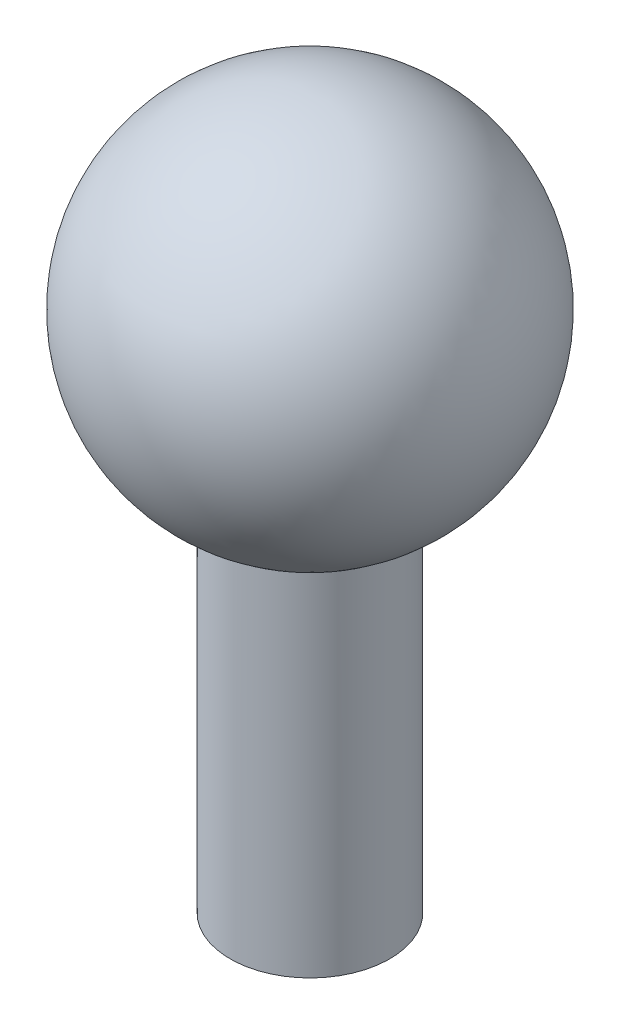
ISO-10303-21;
HEADER;
FILE_DESCRIPTION(('STEP AP214'),'2;1');
FILE_NAME('part.step','',(''),(''),'','','');
FILE_SCHEMA(('AUTOMOTIVE_DESIGN { 1 0 10303 214 1 1 1 1 }'));
ENDSEC;
DATA;
#1=APPLICATION_CONTEXT('core data for automotive mechanical design processes');
#2=APPLICATION_PROTOCOL_DEFINITION('international standard','automotive_design',2000,#1);
#3=PRODUCT_CONTEXT('',#1,'mechanical');
#4=PRODUCT('Part','Part','',(#3));
#5=PRODUCT_RELATED_PRODUCT_CATEGORY('part','',(#4));
#6=PRODUCT_DEFINITION_FORMATION('','',#4);
#7=PRODUCT_DEFINITION_CONTEXT('part definition',#1,'design');
#8=PRODUCT_DEFINITION('design','',#6,#7);
#9=PRODUCT_DEFINITION_SHAPE('','',#8);
#10=(LENGTH_UNIT() NAMED_UNIT(*) SI_UNIT(.MILLI.,.METRE.));
#11=(NAMED_UNIT(*) PLANE_ANGLE_UNIT() SI_UNIT($,.RADIAN.));
#12=(NAMED_UNIT(*) SI_UNIT($,.STERADIAN.) SOLID_ANGLE_UNIT());
#13=UNCERTAINTY_MEASURE_WITH_UNIT(LENGTH_MEASURE(1.E-05),#10,'distance_accuracy_value','');
#14=(GEOMETRIC_REPRESENTATION_CONTEXT(3) GLOBAL_UNCERTAINTY_ASSIGNED_CONTEXT((#13)) GLOBAL_UNIT_ASSIGNED_CONTEXT((#10,
#11,#12)) REPRESENTATION_CONTEXT('',''));
#15=CARTESIAN_POINT('',(0.,0.,0.));
#16=DIRECTION('',(0.,0.,1.));
#17=DIRECTION('',(1.,0.,0.));
#18=AXIS2_PLACEMENT_3D('',#15,#16,#17);
#19=CARTESIAN_POINT('',(0.,0.,0.));
#20=DIRECTION('',(0.,-1.,0.));
#21=DIRECTION('',(-1.,0.,0.));
#22=AXIS2_PLACEMENT_3D('',#19,#20,#21);
#23=SPHERICAL_SURFACE('',#22,7.);
#24=CARTESIAN_POINT('',(0.,-6.32455532033676,0.));
#25=DIRECTION('',(0.,-1.,0.));
#26=DIRECTION('',(0.,0.,-1.));
#27=AXIS2_PLACEMENT_3D('',#24,#25,#26);
#28=CIRCLE('',#27,3.);
#29=CARTESIAN_POINT('',(0.,-6.32455532033676,-3.));
#30=VERTEX_POINT('',#29);
#31=EDGE_CURVE('E10',#30,#30,#28,.T.);
#32=ORIENTED_EDGE('',*,*,#31,.F.);
#33=EDGE_LOOP('',(#32));
#34=FACE_BOUND('',#33,.T.);
#35=ADVANCED_FACE('F32',(#34),#23,.T.);
#36=CARTESIAN_POINT('',(0.,-19.6423200181092,0.));
#37=DIRECTION('',(0.,-1.,0.));
#38=DIRECTION('',(0.,0.,-1.));
#39=AXIS2_PLACEMENT_3D('',#36,#37,#38);
#40=CYLINDRICAL_SURFACE('',#39,3.);
#41=CARTESIAN_POINT('',(0.,-19.6423200181092,0.));
#42=DIRECTION('',(0.,-1.,0.));
#43=DIRECTION('',(0.,0.,-1.));
#44=AXIS2_PLACEMENT_3D('',#41,#42,#43);
#45=CIRCLE('',#44,3.);
#46=CARTESIAN_POINT('',(0.,-19.6423200181092,-3.));
#47=VERTEX_POINT('',#46);
#48=EDGE_CURVE('E38',#47,#47,#45,.T.);
#49=ORIENTED_EDGE('',*,*,#48,.F.);
#50=EDGE_LOOP('',(#49));
#51=FACE_BOUND('',#50,.T.);
#52=ORIENTED_EDGE('',*,*,#31,.T.);
#53=EDGE_LOOP('',(#52));
#54=FACE_BOUND('',#53,.T.);
#55=ADVANCED_FACE('F46',(#51,#54),#40,.T.);
#56=CARTESIAN_POINT('',(-3.,-19.6423200181092,0.));
#57=DIRECTION('',(0.,1.,0.));
#58=DIRECTION('',(0.,0.,1.));
#59=AXIS2_PLACEMENT_3D('',#56,#57,#58);
#60=PLANE('',#59);
#61=ORIENTED_EDGE('',*,*,#48,.T.);
#62=EDGE_LOOP('',(#61));
#63=FACE_BOUND('',#62,.T.);
#64=ADVANCED_FACE('F44',(#63),#60,.F.);
#65=CLOSED_SHELL('',(#35,#55,#64));
#66=MANIFOLD_SOLID_BREP('B2',#65);
#67=ADVANCED_BREP_SHAPE_REPRESENTATION('',(#18,#66),#14);
#68=SHAPE_DEFINITION_REPRESENTATION(#9,#67);
ENDSEC;
END-ISO-10303-21;
